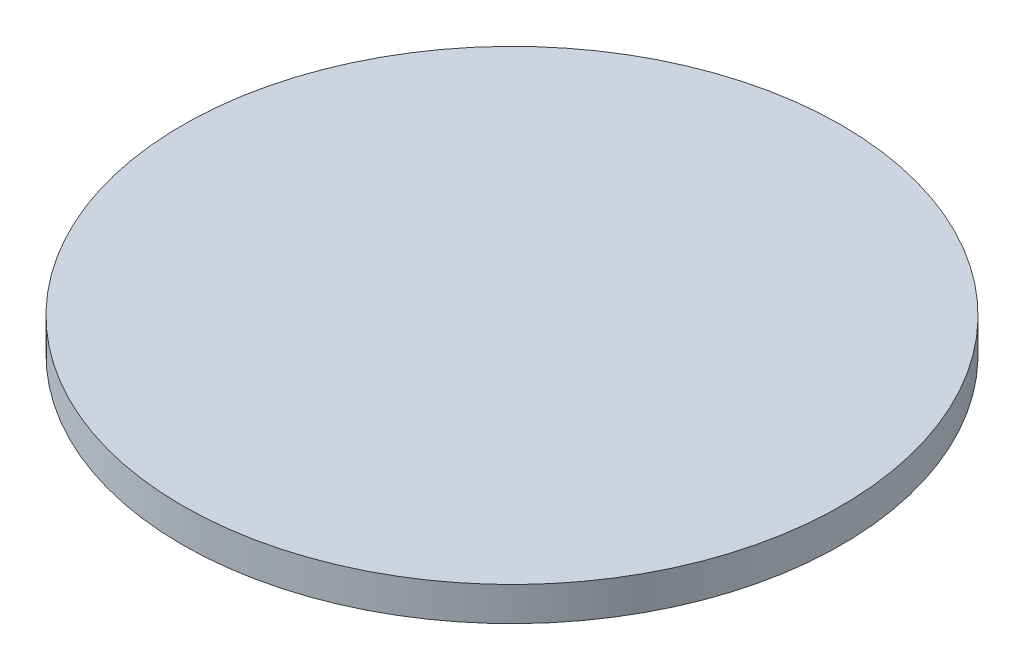
ISO-10303-21;
HEADER;
FILE_DESCRIPTION(('STEP AP214'),'2;1');
FILE_NAME('part.step','',(''),(''),'','','');
FILE_SCHEMA(('AUTOMOTIVE_DESIGN { 1 0 10303 214 1 1 1 1 }'));
ENDSEC;
DATA;
#1=APPLICATION_CONTEXT('core data for automotive mechanical design processes');
#2=APPLICATION_PROTOCOL_DEFINITION('international standard','automotive_design',2000,#1);
#3=PRODUCT_CONTEXT('',#1,'mechanical');
#4=PRODUCT('Part','Part','',(#3));
#5=PRODUCT_RELATED_PRODUCT_CATEGORY('part','',(#4));
#6=PRODUCT_DEFINITION_FORMATION('','',#4);
#7=PRODUCT_DEFINITION_CONTEXT('part definition',#1,'design');
#8=PRODUCT_DEFINITION('design','',#6,#7);
#9=PRODUCT_DEFINITION_SHAPE('','',#8);
#10=(LENGTH_UNIT() NAMED_UNIT(*) SI_UNIT(.MILLI.,.METRE.));
#11=(NAMED_UNIT(*) PLANE_ANGLE_UNIT() SI_UNIT($,.RADIAN.));
#12=(NAMED_UNIT(*) SI_UNIT($,.STERADIAN.) SOLID_ANGLE_UNIT());
#13=UNCERTAINTY_MEASURE_WITH_UNIT(LENGTH_MEASURE(1.E-05),#10,'distance_accuracy_value','');
#14=(GEOMETRIC_REPRESENTATION_CONTEXT(3) GLOBAL_UNCERTAINTY_ASSIGNED_CONTEXT((#13)) GLOBAL_UNIT_ASSIGNED_CONTEXT((#10,
#11,#12)) REPRESENTATION_CONTEXT('',''));
#15=CARTESIAN_POINT('',(0.,0.,0.));
#16=DIRECTION('',(0.,0.,1.));
#17=DIRECTION('',(1.,0.,0.));
#18=AXIS2_PLACEMENT_3D('',#15,#16,#17);
#19=CARTESIAN_POINT('',(16.9802276726045,10.,0.));
#20=DIRECTION('',(0.,-1.,0.));
#21=DIRECTION('',(0.,0.,-1.));
#22=AXIS2_PLACEMENT_3D('',#19,#20,#21);
#23=CYLINDRICAL_SURFACE('',#22,97.1906888401521);
#24=CARTESIAN_POINT('',(16.9802276726045,10.,0.));
#25=DIRECTION('',(0.,1.,0.));
#26=DIRECTION('',(0.,0.,1.));
#27=AXIS2_PLACEMENT_3D('',#24,#25,#26);
#28=CIRCLE('',#27,97.1906888401521);
#29=CARTESIAN_POINT('',(16.9802276726045,10.,97.1906888401521));
#30=VERTEX_POINT('',#29);
#31=EDGE_CURVE('E10',#30,#30,#28,.T.);
#32=ORIENTED_EDGE('',*,*,#31,.F.);
#33=EDGE_LOOP('',(#32));
#34=FACE_BOUND('',#33,.T.);
#35=CARTESIAN_POINT('',(16.9802276726045,0.,0.));
#36=DIRECTION('',(0.,1.,0.));
#37=DIRECTION('',(0.,0.,1.));
#38=AXIS2_PLACEMENT_3D('',#35,#36,#37);
#39=CIRCLE('',#38,97.1906888401521);
#40=CARTESIAN_POINT('',(16.9802276726045,0.,97.1906888401521));
#41=VERTEX_POINT('',#40);
#42=EDGE_CURVE('E35',#41,#41,#39,.T.);
#43=ORIENTED_EDGE('',*,*,#42,.T.);
#44=EDGE_LOOP('',(#43));
#45=FACE_BOUND('',#44,.T.);
#46=ADVANCED_FACE('F32',(#34,#45),#23,.T.);
#47=CARTESIAN_POINT('',(0.,10.,0.));
#48=DIRECTION('',(0.,1.,0.));
#49=DIRECTION('',(0.,0.,1.));
#50=AXIS2_PLACEMENT_3D('',#47,#48,#49);
#51=PLANE('',#50);
#52=ORIENTED_EDGE('',*,*,#31,.T.);
#53=EDGE_LOOP('',(#52));
#54=FACE_BOUND('',#53,.T.);
#55=ADVANCED_FACE('F47',(#54),#51,.T.);
#56=CARTESIAN_POINT('',(0.,0.,0.));
#57=DIRECTION('',(0.,1.,0.));
#58=DIRECTION('',(0.,0.,1.));
#59=AXIS2_PLACEMENT_3D('',#56,#57,#58);
#60=PLANE('',#59);
#61=ORIENTED_EDGE('',*,*,#42,.F.);
#62=EDGE_LOOP('',(#61));
#63=FACE_BOUND('',#62,.T.);
#64=ADVANCED_FACE('F45',(#63),#60,.F.);
#65=CLOSED_SHELL('',(#46,#55,#64));
#66=MANIFOLD_SOLID_BREP('B2',#65);
#67=ADVANCED_BREP_SHAPE_REPRESENTATION('',(#18,#66),#14);
#68=SHAPE_DEFINITION_REPRESENTATION(#9,#67);
ENDSEC;
END-ISO-10303-21;
